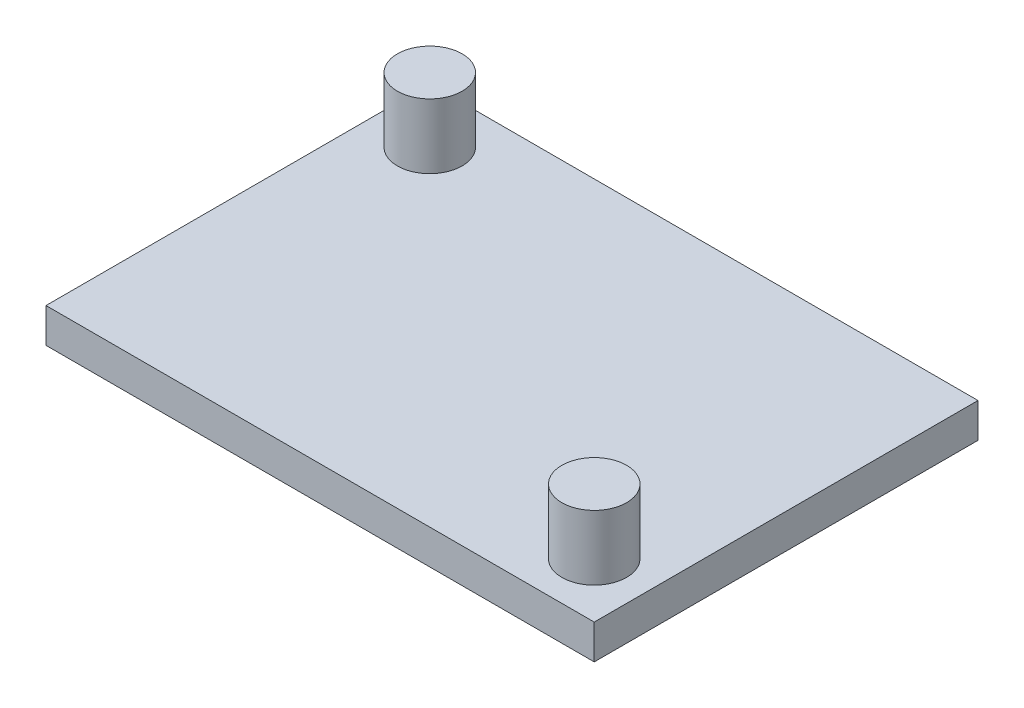
ISO-10303-21;
HEADER;
FILE_DESCRIPTION(('STEP AP214'),'2;1');
FILE_NAME('part.step','',(''),(''),'','','');
FILE_SCHEMA(('AUTOMOTIVE_DESIGN { 1 0 10303 214 1 1 1 1 }'));
ENDSEC;
DATA;
#1=APPLICATION_CONTEXT('core data for automotive mechanical design processes');
#2=APPLICATION_PROTOCOL_DEFINITION('international standard','automotive_design',2000,#1);
#3=PRODUCT_CONTEXT('',#1,'mechanical');
#4=PRODUCT('Part','Part','',(#3));
#5=PRODUCT_RELATED_PRODUCT_CATEGORY('part','',(#4));
#6=PRODUCT_DEFINITION_FORMATION('','',#4);
#7=PRODUCT_DEFINITION_CONTEXT('part definition',#1,'design');
#8=PRODUCT_DEFINITION('design','',#6,#7);
#9=PRODUCT_DEFINITION_SHAPE('','',#8);
#10=(LENGTH_UNIT() NAMED_UNIT(*) SI_UNIT(.MILLI.,.METRE.));
#11=(NAMED_UNIT(*) PLANE_ANGLE_UNIT() SI_UNIT($,.RADIAN.));
#12=(NAMED_UNIT(*) SI_UNIT($,.STERADIAN.) SOLID_ANGLE_UNIT());
#13=UNCERTAINTY_MEASURE_WITH_UNIT(LENGTH_MEASURE(1.E-05),#10,'distance_accuracy_value','');
#14=(GEOMETRIC_REPRESENTATION_CONTEXT(3) GLOBAL_UNCERTAINTY_ASSIGNED_CONTEXT((#13)) GLOBAL_UNIT_ASSIGNED_CONTEXT((#10,
#11,#12)) REPRESENTATION_CONTEXT('',''));
#15=CARTESIAN_POINT('',(0.,0.,0.));
#16=DIRECTION('',(0.,0.,1.));
#17=DIRECTION('',(1.,0.,0.));
#18=AXIS2_PLACEMENT_3D('',#15,#16,#17);
#19=CARTESIAN_POINT('',(-10.16,6.,-6.35));
#20=DIRECTION('',(0.,-1.,0.));
#21=DIRECTION('',(0.,0.,-1.));
#22=AXIS2_PLACEMENT_3D('',#19,#20,#21);
#23=CYLINDRICAL_SURFACE('',#22,1.5);
#24=CARTESIAN_POINT('',(-10.16,6.,-6.35));
#25=DIRECTION('',(0.,1.,0.));
#26=DIRECTION('',(0.,0.,1.));
#27=AXIS2_PLACEMENT_3D('',#24,#25,#26);
#28=CIRCLE('',#27,1.5);
#29=CARTESIAN_POINT('',(-10.16,6.,-4.85));
#30=VERTEX_POINT('',#29);
#31=EDGE_CURVE('E11',#30,#30,#28,.T.);
#32=ORIENTED_EDGE('',*,*,#31,.F.);
#33=EDGE_LOOP('',(#32));
#34=FACE_BOUND('',#33,.T.);
#35=CARTESIAN_POINT('',(-10.16,3.,-6.35));
#36=DIRECTION('',(0.,1.,0.));
#37=DIRECTION('',(0.,0.,1.));
#38=AXIS2_PLACEMENT_3D('',#35,#36,#37);
#39=CIRCLE('',#38,1.5);
#40=CARTESIAN_POINT('',(-10.16,3.,-4.85));
#41=VERTEX_POINT('',#40);
#42=EDGE_CURVE('E46',#41,#41,#39,.T.);
#43=ORIENTED_EDGE('',*,*,#42,.T.);
#44=EDGE_LOOP('',(#43));
#45=FACE_BOUND('',#44,.T.);
#46=ADVANCED_FACE('F43',(#34,#45),#23,.T.);
#47=CARTESIAN_POINT('',(-10.16,6.,-6.35));
#48=DIRECTION('',(0.,1.,0.));
#49=DIRECTION('',(0.,0.,1.));
#50=AXIS2_PLACEMENT_3D('',#47,#48,#49);
#51=PLANE('',#50);
#52=ORIENTED_EDGE('',*,*,#31,.T.);
#53=EDGE_LOOP('',(#52));
#54=FACE_BOUND('',#53,.T.);
#55=ADVANCED_FACE('F215',(#54),#51,.T.);
#56=CARTESIAN_POINT('',(-12.7,3.,-8.89));
#57=DIRECTION('',(1.,0.,0.));
#58=DIRECTION('',(0.,0.,-1.));
#59=AXIS2_PLACEMENT_3D('',#56,#57,#58);
#60=PLANE('',#59);
#61=DIRECTION('',(0.,0.,1.));
#62=VECTOR('',#61,1.);
#63=CARTESIAN_POINT('',(-12.7,1.4,-8.89));
#64=LINE('',#63,#62);
#65=CARTESIAN_POINT('',(-12.7,1.4,-8.89));
#66=VERTEX_POINT('',#65);
#67=CARTESIAN_POINT('',(-12.7,1.4,8.89));
#68=VERTEX_POINT('',#67);
#69=EDGE_CURVE('E159',#66,#68,#64,.T.);
#70=ORIENTED_EDGE('',*,*,#69,.T.);
#71=DIRECTION('',(0.,-1.,0.));
#72=VECTOR('',#71,1.);
#73=CARTESIAN_POINT('',(-12.7,3.,8.89));
#74=LINE('',#73,#72);
#75=CARTESIAN_POINT('',(-12.7,3.,8.89));
#76=VERTEX_POINT('',#75);
#77=EDGE_CURVE('E181',#76,#68,#74,.T.);
#78=ORIENTED_EDGE('',*,*,#77,.F.);
#79=DIRECTION('',(0.,0.,1.));
#80=VECTOR('',#79,1.);
#81=CARTESIAN_POINT('',(-12.7,3.,-8.89));
#82=LINE('',#81,#80);
#83=CARTESIAN_POINT('',(-12.7,3.,-8.89));
#84=VERTEX_POINT('',#83);
#85=EDGE_CURVE('E162',#84,#76,#82,.T.);
#86=ORIENTED_EDGE('',*,*,#85,.F.);
#87=DIRECTION('',(0.,-1.,0.));
#88=VECTOR('',#87,1.);
#89=CARTESIAN_POINT('',(-12.7,3.,-8.89));
#90=LINE('',#89,#88);
#91=EDGE_CURVE('E166',#84,#66,#90,.T.);
#92=ORIENTED_EDGE('',*,*,#91,.T.);
#93=EDGE_LOOP('',(#70,#78,#86,#92));
#94=FACE_BOUND('',#93,.T.);
#95=ADVANCED_FACE('F198',(#94),#60,.F.);
#96=CARTESIAN_POINT('',(-12.7,3.,8.89));
#97=DIRECTION('',(0.,0.,-1.));
#98=DIRECTION('',(-1.,0.,0.));
#99=AXIS2_PLACEMENT_3D('',#96,#97,#98);
#100=PLANE('',#99);
#101=DIRECTION('',(1.,0.,0.));
#102=VECTOR('',#101,1.);
#103=CARTESIAN_POINT('',(-12.7,1.4,8.89));
#104=LINE('',#103,#102);
#105=CARTESIAN_POINT('',(12.7,1.4,8.89));
#106=VERTEX_POINT('',#105);
#107=EDGE_CURVE('E171',#68,#106,#104,.T.);
#108=ORIENTED_EDGE('',*,*,#107,.T.);
#109=DIRECTION('',(0.,-1.,0.));
#110=VECTOR('',#109,1.);
#111=CARTESIAN_POINT('',(12.7,3.,8.89));
#112=LINE('',#111,#110);
#113=CARTESIAN_POINT('',(12.7,3.,8.89));
#114=VERTEX_POINT('',#113);
#115=EDGE_CURVE('E179',#114,#106,#112,.T.);
#116=ORIENTED_EDGE('',*,*,#115,.F.);
#117=DIRECTION('',(1.,0.,0.));
#118=VECTOR('',#117,1.);
#119=CARTESIAN_POINT('',(-12.7,3.,8.89));
#120=LINE('',#119,#118);
#121=EDGE_CURVE('E92',#76,#114,#120,.T.);
#122=ORIENTED_EDGE('',*,*,#121,.F.);
#123=ORIENTED_EDGE('',*,*,#77,.T.);
#124=EDGE_LOOP('',(#108,#116,#122,#123));
#125=FACE_BOUND('',#124,.T.);
#126=ADVANCED_FACE('F200',(#125),#100,.F.);
#127=CARTESIAN_POINT('',(12.7,3.,8.89));
#128=DIRECTION('',(-1.,0.,0.));
#129=DIRECTION('',(0.,0.,1.));
#130=AXIS2_PLACEMENT_3D('',#127,#128,#129);
#131=PLANE('',#130);
#132=DIRECTION('',(0.,0.,-1.));
#133=VECTOR('',#132,1.);
#134=CARTESIAN_POINT('',(12.7,1.4,8.89));
#135=LINE('',#134,#133);
#136=CARTESIAN_POINT('',(12.7,1.4,-8.89));
#137=VERTEX_POINT('',#136);
#138=EDGE_CURVE('E173',#106,#137,#135,.T.);
#139=ORIENTED_EDGE('',*,*,#138,.T.);
#140=DIRECTION('',(0.,-1.,0.));
#141=VECTOR('',#140,1.);
#142=CARTESIAN_POINT('',(12.7,3.,-8.89));
#143=LINE('',#142,#141);
#144=CARTESIAN_POINT('',(12.7,3.,-8.89));
#145=VERTEX_POINT('',#144);
#146=EDGE_CURVE('E177',#145,#137,#143,.T.);
#147=ORIENTED_EDGE('',*,*,#146,.F.);
#148=DIRECTION('',(0.,0.,-1.));
#149=VECTOR('',#148,1.);
#150=CARTESIAN_POINT('',(12.7,3.,8.89));
#151=LINE('',#150,#149);
#152=EDGE_CURVE('E167',#114,#145,#151,.T.);
#153=ORIENTED_EDGE('',*,*,#152,.F.);
#154=ORIENTED_EDGE('',*,*,#115,.T.);
#155=EDGE_LOOP('',(#139,#147,#153,#154));
#156=FACE_BOUND('',#155,.T.);
#157=ADVANCED_FACE('F205',(#156),#131,.F.);
#158=CARTESIAN_POINT('',(12.7,3.,-8.89));
#159=DIRECTION('',(0.,0.,1.));
#160=DIRECTION('',(1.,0.,0.));
#161=AXIS2_PLACEMENT_3D('',#158,#159,#160);
#162=PLANE('',#161);
#163=DIRECTION('',(-1.,0.,0.));
#164=VECTOR('',#163,1.);
#165=CARTESIAN_POINT('',(12.7,1.4,-8.89));
#166=LINE('',#165,#164);
#167=EDGE_CURVE('E87',#137,#66,#166,.T.);
#168=ORIENTED_EDGE('',*,*,#167,.T.);
#169=ORIENTED_EDGE('',*,*,#91,.F.);
#170=DIRECTION('',(-1.,0.,0.));
#171=VECTOR('',#170,1.);
#172=CARTESIAN_POINT('',(12.7,3.,-8.89));
#173=LINE('',#172,#171);
#174=EDGE_CURVE('E66',#145,#84,#173,.T.);
#175=ORIENTED_EDGE('',*,*,#174,.F.);
#176=ORIENTED_EDGE('',*,*,#146,.T.);
#177=EDGE_LOOP('',(#168,#169,#175,#176));
#178=FACE_BOUND('',#177,.T.);
#179=ADVANCED_FACE('F191',(#178),#162,.F.);
#180=CARTESIAN_POINT('',(0.,3.,0.));
#181=DIRECTION('',(0.,1.,0.));
#182=DIRECTION('',(0.,0.,1.));
#183=AXIS2_PLACEMENT_3D('',#180,#181,#182);
#184=PLANE('',#183);
#185=CARTESIAN_POINT('',(10.16,3.,6.35));
#186=DIRECTION('',(0.,1.,0.));
#187=DIRECTION('',(0.,0.,1.));
#188=AXIS2_PLACEMENT_3D('',#185,#186,#187);
#189=CIRCLE('',#188,1.5);
#190=CARTESIAN_POINT('',(10.16,3.,7.85));
#191=VERTEX_POINT('',#190);
#192=EDGE_CURVE('E135',#191,#191,#189,.T.);
#193=ORIENTED_EDGE('',*,*,#192,.F.);
#194=EDGE_LOOP('',(#193));
#195=FACE_BOUND('',#194,.T.);
#196=ORIENTED_EDGE('',*,*,#42,.F.);
#197=EDGE_LOOP('',(#196));
#198=FACE_BOUND('',#197,.T.);
#199=ORIENTED_EDGE('',*,*,#85,.T.);
#200=ORIENTED_EDGE('',*,*,#121,.T.);
#201=ORIENTED_EDGE('',*,*,#152,.T.);
#202=ORIENTED_EDGE('',*,*,#174,.T.);
#203=EDGE_LOOP('',(#199,#200,#201,#202));
#204=FACE_BOUND('',#203,.T.);
#205=ADVANCED_FACE('F188',(#195,#198,#204),#184,.T.);
#206=CARTESIAN_POINT('',(0.,1.4,0.));
#207=DIRECTION('',(0.,1.,0.));
#208=DIRECTION('',(0.,0.,1.));
#209=AXIS2_PLACEMENT_3D('',#206,#207,#208);
#210=PLANE('',#209);
#211=DIRECTION('',(-1.,0.,0.));
#212=VECTOR('',#211,1.);
#213=CARTESIAN_POINT('',(2.5,1.4,-1.5));
#214=LINE('',#213,#212);
#215=CARTESIAN_POINT('',(2.5,1.4,-1.5));
#216=VERTEX_POINT('',#215);
#217=CARTESIAN_POINT('',(-2.5,1.4,-1.5));
#218=VERTEX_POINT('',#217);
#219=EDGE_CURVE('E138',#216,#218,#214,.T.);
#220=ORIENTED_EDGE('',*,*,#219,.T.);
#221=DIRECTION('',(0.,0.,1.));
#222=VECTOR('',#221,1.);
#223=CARTESIAN_POINT('',(-2.5,1.4,-1.5));
#224=LINE('',#223,#222);
#225=CARTESIAN_POINT('',(-2.5,1.4,1.5));
#226=VERTEX_POINT('',#225);
#227=EDGE_CURVE('E60',#218,#226,#224,.T.);
#228=ORIENTED_EDGE('',*,*,#227,.T.);
#229=DIRECTION('',(1.,0.,0.));
#230=VECTOR('',#229,1.);
#231=CARTESIAN_POINT('',(-2.5,1.4,1.5));
#232=LINE('',#231,#230);
#233=CARTESIAN_POINT('',(2.5,1.4,1.5));
#234=VERTEX_POINT('',#233);
#235=EDGE_CURVE('E118',#226,#234,#232,.T.);
#236=ORIENTED_EDGE('',*,*,#235,.T.);
#237=DIRECTION('',(0.,0.,-1.));
#238=VECTOR('',#237,1.);
#239=CARTESIAN_POINT('',(2.5,1.4,1.5));
#240=LINE('',#239,#238);
#241=EDGE_CURVE('E126',#234,#216,#240,.T.);
#242=ORIENTED_EDGE('',*,*,#241,.T.);
#243=EDGE_LOOP('',(#220,#228,#236,#242));
#244=FACE_BOUND('',#243,.T.);
#245=ORIENTED_EDGE('',*,*,#69,.F.);
#246=ORIENTED_EDGE('',*,*,#167,.F.);
#247=ORIENTED_EDGE('',*,*,#138,.F.);
#248=ORIENTED_EDGE('',*,*,#107,.F.);
#249=EDGE_LOOP('',(#245,#246,#247,#248));
#250=FACE_BOUND('',#249,.T.);
#251=ADVANCED_FACE('F136',(#244,#250),#210,.F.);
#252=CARTESIAN_POINT('',(10.16,6.,6.35));
#253=DIRECTION('',(0.,-1.,0.));
#254=DIRECTION('',(0.,0.,-1.));
#255=AXIS2_PLACEMENT_3D('',#252,#253,#254);
#256=CYLINDRICAL_SURFACE('',#255,1.5);
#257=CARTESIAN_POINT('',(10.16,6.,6.35));
#258=DIRECTION('',(0.,1.,0.));
#259=DIRECTION('',(0.,0.,1.));
#260=AXIS2_PLACEMENT_3D('',#257,#258,#259);
#261=CIRCLE('',#260,1.5);
#262=CARTESIAN_POINT('',(10.16,6.,7.85));
#263=VERTEX_POINT('',#262);
#264=EDGE_CURVE('E160',#263,#263,#261,.T.);
#265=ORIENTED_EDGE('',*,*,#264,.F.);
#266=EDGE_LOOP('',(#265));
#267=FACE_BOUND('',#266,.T.);
#268=ORIENTED_EDGE('',*,*,#192,.T.);
#269=EDGE_LOOP('',(#268));
#270=FACE_BOUND('',#269,.T.);
#271=ADVANCED_FACE('F251',(#267,#270),#256,.T.);
#272=CARTESIAN_POINT('',(10.16,6.,6.35));
#273=DIRECTION('',(0.,1.,0.));
#274=DIRECTION('',(0.,0.,1.));
#275=AXIS2_PLACEMENT_3D('',#272,#273,#274);
#276=PLANE('',#275);
#277=ORIENTED_EDGE('',*,*,#264,.T.);
#278=EDGE_LOOP('',(#277));
#279=FACE_BOUND('',#278,.T.);
#280=ADVANCED_FACE('F265',(#279),#276,.T.);
#281=CARTESIAN_POINT('',(-2.5,1.4,-1.5));
#282=DIRECTION('',(1.,0.,0.));
#283=DIRECTION('',(0.,0.,-1.));
#284=AXIS2_PLACEMENT_3D('',#281,#282,#283);
#285=PLANE('',#284);
#286=DIRECTION('',(0.,0.,1.));
#287=VECTOR('',#286,1.);
#288=CARTESIAN_POINT('',(-2.5,0.,-1.5));
#289=LINE('',#288,#287);
#290=CARTESIAN_POINT('',(-2.5,0.,-1.5));
#291=VERTEX_POINT('',#290);
#292=CARTESIAN_POINT('',(-2.5,0.,1.5));
#293=VERTEX_POINT('',#292);
#294=EDGE_CURVE('E131',#291,#293,#289,.T.);
#295=ORIENTED_EDGE('',*,*,#294,.T.);
#296=DIRECTION('',(0.,-1.,0.));
#297=VECTOR('',#296,1.);
#298=CARTESIAN_POINT('',(-2.5,1.4,1.5));
#299=LINE('',#298,#297);
#300=EDGE_CURVE('E121',#226,#293,#299,.T.);
#301=ORIENTED_EDGE('',*,*,#300,.F.);
#302=ORIENTED_EDGE('',*,*,#227,.F.);
#303=DIRECTION('',(0.,-1.,0.));
#304=VECTOR('',#303,1.);
#305=CARTESIAN_POINT('',(-2.5,1.4,-1.5));
#306=LINE('',#305,#304);
#307=EDGE_CURVE('E150',#218,#291,#306,.T.);
#308=ORIENTED_EDGE('',*,*,#307,.T.);
#309=EDGE_LOOP('',(#295,#301,#302,#308));
#310=FACE_BOUND('',#309,.T.);
#311=ADVANCED_FACE('F128',(#310),#285,.F.);
#312=CARTESIAN_POINT('',(-2.5,1.4,1.5));
#313=DIRECTION('',(0.,0.,-1.));
#314=DIRECTION('',(-1.,0.,0.));
#315=AXIS2_PLACEMENT_3D('',#312,#313,#314);
#316=PLANE('',#315);
#317=DIRECTION('',(1.,0.,0.));
#318=VECTOR('',#317,1.);
#319=CARTESIAN_POINT('',(-2.5,0.,1.5));
#320=LINE('',#319,#318);
#321=CARTESIAN_POINT('',(2.5,0.,1.5));
#322=VERTEX_POINT('',#321);
#323=EDGE_CURVE('E149',#293,#322,#320,.T.);
#324=ORIENTED_EDGE('',*,*,#323,.T.);
#325=DIRECTION('',(0.,-1.,0.));
#326=VECTOR('',#325,1.);
#327=CARTESIAN_POINT('',(2.5,1.4,1.5));
#328=LINE('',#327,#326);
#329=EDGE_CURVE('E123',#234,#322,#328,.T.);
#330=ORIENTED_EDGE('',*,*,#329,.F.);
#331=ORIENTED_EDGE('',*,*,#235,.F.);
#332=ORIENTED_EDGE('',*,*,#300,.T.);
#333=EDGE_LOOP('',(#324,#330,#331,#332));
#334=FACE_BOUND('',#333,.T.);
#335=ADVANCED_FACE('F117',(#334),#316,.F.);
#336=CARTESIAN_POINT('',(2.5,1.4,1.5));
#337=DIRECTION('',(-1.,0.,0.));
#338=DIRECTION('',(0.,0.,1.));
#339=AXIS2_PLACEMENT_3D('',#336,#337,#338);
#340=PLANE('',#339);
#341=DIRECTION('',(0.,0.,-1.));
#342=VECTOR('',#341,1.);
#343=CARTESIAN_POINT('',(2.5,0.,1.5));
#344=LINE('',#343,#342);
#345=CARTESIAN_POINT('',(2.5,0.,-1.5));
#346=VERTEX_POINT('',#345);
#347=EDGE_CURVE('E142',#322,#346,#344,.T.);
#348=ORIENTED_EDGE('',*,*,#347,.T.);
#349=DIRECTION('',(0.,-1.,0.));
#350=VECTOR('',#349,1.);
#351=CARTESIAN_POINT('',(2.5,1.4,-1.5));
#352=LINE('',#351,#350);
#353=EDGE_CURVE('E153',#216,#346,#352,.T.);
#354=ORIENTED_EDGE('',*,*,#353,.F.);
#355=ORIENTED_EDGE('',*,*,#241,.F.);
#356=ORIENTED_EDGE('',*,*,#329,.T.);
#357=EDGE_LOOP('',(#348,#354,#355,#356));
#358=FACE_BOUND('',#357,.T.);
#359=ADVANCED_FACE('F290',(#358),#340,.F.);
#360=CARTESIAN_POINT('',(2.5,1.4,-1.5));
#361=DIRECTION('',(0.,0.,1.));
#362=DIRECTION('',(1.,0.,0.));
#363=AXIS2_PLACEMENT_3D('',#360,#361,#362);
#364=PLANE('',#363);
#365=DIRECTION('',(-1.,0.,0.));
#366=VECTOR('',#365,1.);
#367=CARTESIAN_POINT('',(2.5,0.,-1.5));
#368=LINE('',#367,#366);
#369=EDGE_CURVE('E139',#346,#291,#368,.T.);
#370=ORIENTED_EDGE('',*,*,#369,.T.);
#371=ORIENTED_EDGE('',*,*,#307,.F.);
#372=ORIENTED_EDGE('',*,*,#219,.F.);
#373=ORIENTED_EDGE('',*,*,#353,.T.);
#374=EDGE_LOOP('',(#370,#371,#372,#373));
#375=FACE_BOUND('',#374,.T.);
#376=ADVANCED_FACE('F299',(#375),#364,.F.);
#377=CARTESIAN_POINT('',(0.,0.,0.));
#378=DIRECTION('',(0.,1.,0.));
#379=DIRECTION('',(0.,0.,1.));
#380=AXIS2_PLACEMENT_3D('',#377,#378,#379);
#381=PLANE('',#380);
#382=ORIENTED_EDGE('',*,*,#294,.F.);
#383=ORIENTED_EDGE('',*,*,#369,.F.);
#384=ORIENTED_EDGE('',*,*,#347,.F.);
#385=ORIENTED_EDGE('',*,*,#323,.F.);
#386=EDGE_LOOP('',(#382,#383,#384,#385));
#387=FACE_BOUND('',#386,.T.);
#388=ADVANCED_FACE('F308',(#387),#381,.F.);
#389=CLOSED_SHELL('',(#46,#55,#95,#126,#157,#179,#205,#251,#271,#280,#311,#335,#359,#376,#388));
#390=MANIFOLD_SOLID_BREP('B2',#389);
#391=ADVANCED_BREP_SHAPE_REPRESENTATION('',(#18,#390),#14);
#392=SHAPE_DEFINITION_REPRESENTATION(#9,#391);
ENDSEC;
END-ISO-10303-21;
